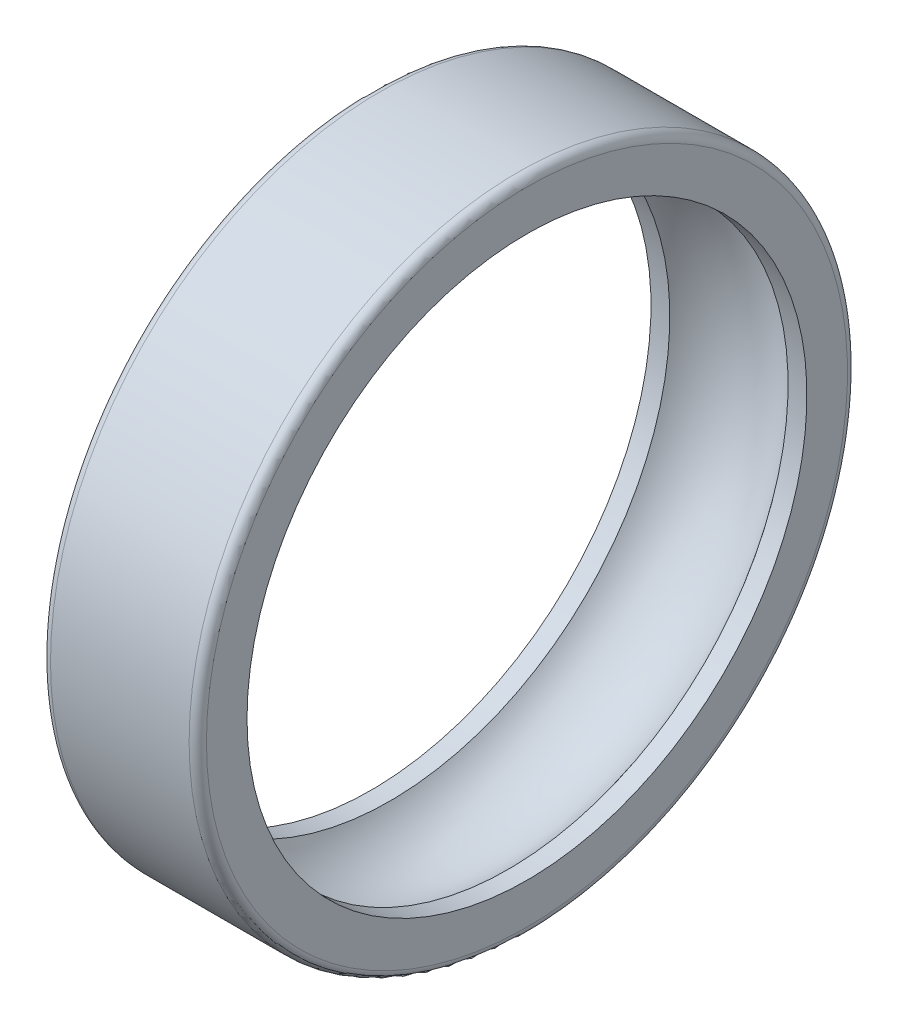
ISO-10303-21;
HEADER;
FILE_DESCRIPTION(('STEP AP214'),'2;1');
FILE_NAME('part.step','',(''),(''),'','','');
FILE_SCHEMA(('AUTOMOTIVE_DESIGN { 1 0 10303 214 1 1 1 1 }'));
ENDSEC;
DATA;
#1=APPLICATION_CONTEXT('core data for automotive mechanical design processes');
#2=APPLICATION_PROTOCOL_DEFINITION('international standard','automotive_design',2000,#1);
#3=PRODUCT_CONTEXT('',#1,'mechanical');
#4=PRODUCT('Part','Part','',(#3));
#5=PRODUCT_RELATED_PRODUCT_CATEGORY('part','',(#4));
#6=PRODUCT_DEFINITION_FORMATION('','',#4);
#7=PRODUCT_DEFINITION_CONTEXT('part definition',#1,'design');
#8=PRODUCT_DEFINITION('design','',#6,#7);
#9=PRODUCT_DEFINITION_SHAPE('','',#8);
#10=(LENGTH_UNIT() NAMED_UNIT(*) SI_UNIT(.MILLI.,.METRE.));
#11=(NAMED_UNIT(*) PLANE_ANGLE_UNIT() SI_UNIT($,.RADIAN.));
#12=(NAMED_UNIT(*) SI_UNIT($,.STERADIAN.) SOLID_ANGLE_UNIT());
#13=UNCERTAINTY_MEASURE_WITH_UNIT(LENGTH_MEASURE(1.E-05),#10,'distance_accuracy_value','');
#14=(GEOMETRIC_REPRESENTATION_CONTEXT(3) GLOBAL_UNCERTAINTY_ASSIGNED_CONTEXT((#13)) GLOBAL_UNIT_ASSIGNED_CONTEXT((#10,
#11,#12)) REPRESENTATION_CONTEXT('',''));
#15=CARTESIAN_POINT('',(0.,0.,0.));
#16=DIRECTION('',(0.,0.,1.));
#17=DIRECTION('',(1.,0.,0.));
#18=AXIS2_PLACEMENT_3D('',#15,#16,#17);
#19=CARTESIAN_POINT('',(-22.5,80.79,0.));
#20=DIRECTION('',(1.,0.,0.));
#21=DIRECTION('',(0.,0.,-1.));
#22=AXIS2_PLACEMENT_3D('',#19,#20,#21);
#23=PLANE('',#22);
#24=CARTESIAN_POINT('',(-22.5,0.,0.));
#25=DIRECTION('',(1.,0.,0.));
#26=DIRECTION('',(0.,0.,-1.));
#27=AXIS2_PLACEMENT_3D('',#24,#25,#26);
#28=CIRCLE('',#27,92.5);
#29=CARTESIAN_POINT('',(-22.5,0.,-92.5));
#30=VERTEX_POINT('',#29);
#31=EDGE_CURVE('E10',#30,#30,#28,.F.);
#32=ORIENTED_EDGE('',*,*,#31,.T.);
#33=EDGE_LOOP('',(#32));
#34=FACE_BOUND('',#33,.T.);
#35=CARTESIAN_POINT('',(-22.5,0.,0.));
#36=DIRECTION('',(-1.,0.,0.));
#37=DIRECTION('',(0.,0.,1.));
#38=AXIS2_PLACEMENT_3D('',#35,#36,#37);
#39=CIRCLE('',#38,80.79);
#40=CARTESIAN_POINT('',(-22.5,0.,80.79));
#41=VERTEX_POINT('',#40);
#42=EDGE_CURVE('E64',#41,#41,#39,.T.);
#43=ORIENTED_EDGE('',*,*,#42,.F.);
#44=EDGE_LOOP('',(#43));
#45=FACE_BOUND('',#44,.T.);
#46=ADVANCED_FACE('F35',(#34,#45),#23,.F.);
#47=CARTESIAN_POINT('',(-12.9935214124266,0.,0.));
#48=DIRECTION('',(-1.,0.,0.));
#49=DIRECTION('',(0.,0.,1.));
#50=AXIS2_PLACEMENT_3D('',#47,#48,#49);
#51=CYLINDRICAL_SURFACE('',#50,95.);
#52=CARTESIAN_POINT('',(20.,0.,0.));
#53=DIRECTION('',(-1.,0.,0.));
#54=DIRECTION('',(0.,0.,1.));
#55=AXIS2_PLACEMENT_3D('',#52,#53,#54);
#56=CIRCLE('',#55,95.);
#57=CARTESIAN_POINT('',(20.,0.,95.));
#58=VERTEX_POINT('',#57);
#59=EDGE_CURVE('E46',#58,#58,#56,.T.);
#60=ORIENTED_EDGE('',*,*,#59,.T.);
#61=EDGE_LOOP('',(#60));
#62=FACE_BOUND('',#61,.T.);
#63=CARTESIAN_POINT('',(-20.,0.,0.));
#64=DIRECTION('',(1.,0.,0.));
#65=DIRECTION('',(0.,0.,-1.));
#66=AXIS2_PLACEMENT_3D('',#63,#64,#65);
#67=CIRCLE('',#66,95.);
#68=CARTESIAN_POINT('',(-20.,0.,-95.));
#69=VERTEX_POINT('',#68);
#70=EDGE_CURVE('E50',#69,#69,#67,.T.);
#71=ORIENTED_EDGE('',*,*,#70,.T.);
#72=EDGE_LOOP('',(#71));
#73=FACE_BOUND('',#72,.T.);
#74=ADVANCED_FACE('F71',(#62,#73),#51,.T.);
#75=CARTESIAN_POINT('',(22.5,80.79,0.));
#76=DIRECTION('',(-1.,0.,0.));
#77=DIRECTION('',(0.,0.,1.));
#78=AXIS2_PLACEMENT_3D('',#75,#76,#77);
#79=PLANE('',#78);
#80=CARTESIAN_POINT('',(22.5,0.,0.));
#81=DIRECTION('',(-1.,0.,0.));
#82=DIRECTION('',(0.,0.,1.));
#83=AXIS2_PLACEMENT_3D('',#80,#81,#82);
#84=CIRCLE('',#83,92.5);
#85=CARTESIAN_POINT('',(22.5,0.,92.5));
#86=VERTEX_POINT('',#85);
#87=EDGE_CURVE('E42',#86,#86,#84,.F.);
#88=ORIENTED_EDGE('',*,*,#87,.T.);
#89=EDGE_LOOP('',(#88));
#90=FACE_BOUND('',#89,.T.);
#91=CARTESIAN_POINT('',(22.5,0.,0.));
#92=DIRECTION('',(-1.,0.,0.));
#93=DIRECTION('',(0.,0.,1.));
#94=AXIS2_PLACEMENT_3D('',#91,#92,#93);
#95=CIRCLE('',#94,80.79);
#96=CARTESIAN_POINT('',(22.5,0.,80.79));
#97=VERTEX_POINT('',#96);
#98=EDGE_CURVE('E55',#97,#97,#95,.T.);
#99=ORIENTED_EDGE('',*,*,#98,.T.);
#100=EDGE_LOOP('',(#99));
#101=FACE_BOUND('',#100,.T.);
#102=ADVANCED_FACE('F76',(#90,#101),#79,.F.);
#103=CARTESIAN_POINT('',(-12.9935214124266,0.,0.));
#104=DIRECTION('',(-1.,0.,0.));
#105=DIRECTION('',(0.,0.,1.));
#106=AXIS2_PLACEMENT_3D('',#103,#104,#105);
#107=CYLINDRICAL_SURFACE('',#106,80.79);
#108=ORIENTED_EDGE('',*,*,#98,.F.);
#109=EDGE_LOOP('',(#108));
#110=FACE_BOUND('',#109,.T.);
#111=CARTESIAN_POINT('',(17.0681721341214,0.,0.));
#112=DIRECTION('',(-1.,0.,0.));
#113=DIRECTION('',(0.,0.,1.));
#114=AXIS2_PLACEMENT_3D('',#111,#112,#113);
#115=CIRCLE('',#114,80.79);
#116=CARTESIAN_POINT('',(17.0681721341214,0.,80.79));
#117=VERTEX_POINT('',#116);
#118=EDGE_CURVE('E58',#117,#117,#115,.T.);
#119=ORIENTED_EDGE('',*,*,#118,.T.);
#120=EDGE_LOOP('',(#119));
#121=FACE_BOUND('',#120,.T.);
#122=ADVANCED_FACE('F99',(#110,#121),#107,.F.);
#123=CARTESIAN_POINT('',(0.,0.,0.));
#124=DIRECTION('',(-1.,0.,0.));
#125=DIRECTION('',(0.,0.,1.));
#126=AXIS2_PLACEMENT_3D('',#123,#124,#125);
#127=TOROIDAL_SURFACE('',#126,68.99,20.75);
#128=ORIENTED_EDGE('',*,*,#118,.F.);
#129=EDGE_LOOP('',(#128));
#130=FACE_BOUND('',#129,.T.);
#131=CARTESIAN_POINT('',(-17.0681721341214,0.,0.));
#132=DIRECTION('',(-1.,0.,0.));
#133=DIRECTION('',(0.,0.,1.));
#134=AXIS2_PLACEMENT_3D('',#131,#132,#133);
#135=CIRCLE('',#134,80.79);
#136=CARTESIAN_POINT('',(-17.0681721341214,0.,80.79));
#137=VERTEX_POINT('',#136);
#138=EDGE_CURVE('E61',#137,#137,#135,.T.);
#139=ORIENTED_EDGE('',*,*,#138,.T.);
#140=EDGE_LOOP('',(#139));
#141=FACE_BOUND('',#140,.T.);
#142=ADVANCED_FACE('F88',(#130,#141),#127,.F.);
#143=CARTESIAN_POINT('',(-12.9935214124266,0.,0.));
#144=DIRECTION('',(-1.,0.,0.));
#145=DIRECTION('',(0.,0.,1.));
#146=AXIS2_PLACEMENT_3D('',#143,#144,#145);
#147=CYLINDRICAL_SURFACE('',#146,80.79);
#148=ORIENTED_EDGE('',*,*,#138,.F.);
#149=EDGE_LOOP('',(#148));
#150=FACE_BOUND('',#149,.T.);
#151=ORIENTED_EDGE('',*,*,#42,.T.);
#152=EDGE_LOOP('',(#151));
#153=FACE_BOUND('',#152,.T.);
#154=ADVANCED_FACE('F68',(#150,#153),#147,.F.);
#155=CARTESIAN_POINT('',(20.,0.,0.));
#156=DIRECTION('',(-1.,0.,0.));
#157=DIRECTION('',(0.,0.,1.));
#158=AXIS2_PLACEMENT_3D('',#155,#156,#157);
#159=TOROIDAL_SURFACE('',#158,92.5,2.5);
#160=ORIENTED_EDGE('',*,*,#87,.F.);
#161=EDGE_LOOP('',(#160));
#162=FACE_BOUND('',#161,.T.);
#163=ORIENTED_EDGE('',*,*,#59,.F.);
#164=EDGE_LOOP('',(#163));
#165=FACE_BOUND('',#164,.T.);
#166=ADVANCED_FACE('F80',(#162,#165),#159,.T.);
#167=CARTESIAN_POINT('',(-20.,0.,0.));
#168=DIRECTION('',(1.,0.,0.));
#169=DIRECTION('',(0.,0.,-1.));
#170=AXIS2_PLACEMENT_3D('',#167,#168,#169);
#171=TOROIDAL_SURFACE('',#170,92.5,2.5);
#172=ORIENTED_EDGE('',*,*,#70,.F.);
#173=EDGE_LOOP('',(#172));
#174=FACE_BOUND('',#173,.T.);
#175=ORIENTED_EDGE('',*,*,#31,.F.);
#176=EDGE_LOOP('',(#175));
#177=FACE_BOUND('',#176,.T.);
#178=ADVANCED_FACE('F37',(#174,#177),#171,.T.);
#179=CLOSED_SHELL('',(#46,#74,#102,#122,#142,#154,#166,#178));
#180=MANIFOLD_SOLID_BREP('B2',#179);
#181=ADVANCED_BREP_SHAPE_REPRESENTATION('',(#18,#180),#14);
#182=SHAPE_DEFINITION_REPRESENTATION(#9,#181);
ENDSEC;
END-ISO-10303-21;
